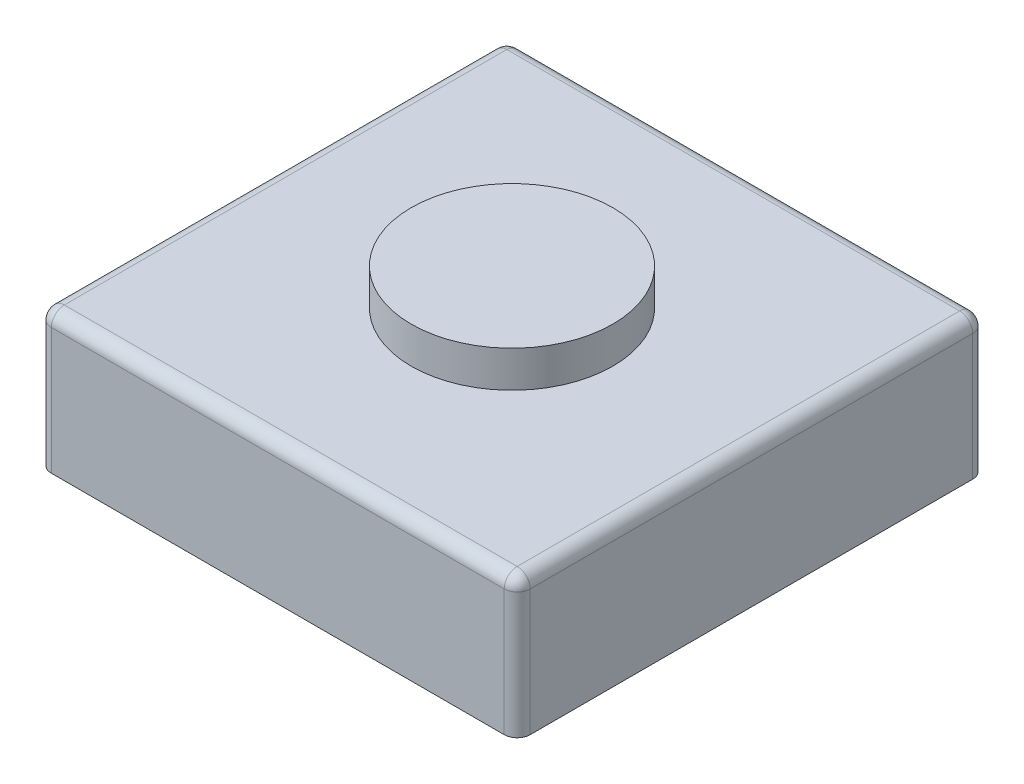
ISO-10303-21;
HEADER;
FILE_DESCRIPTION(('STEP AP214'),'2;1');
FILE_NAME('part.step','',(''),(''),'','','');
FILE_SCHEMA(('AUTOMOTIVE_DESIGN { 1 0 10303 214 1 1 1 1 }'));
ENDSEC;
DATA;
#1=APPLICATION_CONTEXT('core data for automotive mechanical design processes');
#2=APPLICATION_PROTOCOL_DEFINITION('international standard','automotive_design',2000,#1);
#3=PRODUCT_CONTEXT('',#1,'mechanical');
#4=PRODUCT('Part','Part','',(#3));
#5=PRODUCT_RELATED_PRODUCT_CATEGORY('part','',(#4));
#6=PRODUCT_DEFINITION_FORMATION('','',#4);
#7=PRODUCT_DEFINITION_CONTEXT('part definition',#1,'design');
#8=PRODUCT_DEFINITION('design','',#6,#7);
#9=PRODUCT_DEFINITION_SHAPE('','',#8);
#10=(LENGTH_UNIT() NAMED_UNIT(*) SI_UNIT(.MILLI.,.METRE.));
#11=(NAMED_UNIT(*) PLANE_ANGLE_UNIT() SI_UNIT($,.RADIAN.));
#12=(NAMED_UNIT(*) SI_UNIT($,.STERADIAN.) SOLID_ANGLE_UNIT());
#13=UNCERTAINTY_MEASURE_WITH_UNIT(LENGTH_MEASURE(1.E-05),#10,'distance_accuracy_value','');
#14=(GEOMETRIC_REPRESENTATION_CONTEXT(3) GLOBAL_UNCERTAINTY_ASSIGNED_CONTEXT((#13)) GLOBAL_UNIT_ASSIGNED_CONTEXT((#10,
#11,#12)) REPRESENTATION_CONTEXT('',''));
#15=CARTESIAN_POINT('',(0.,0.,0.));
#16=DIRECTION('',(0.,0.,1.));
#17=DIRECTION('',(1.,0.,0.));
#18=AXIS2_PLACEMENT_3D('',#15,#16,#17);
#19=CARTESIAN_POINT('',(-15.9344262295082,10.7,-10.327868852459));
#20=DIRECTION('',(1.,0.,0.));
#21=DIRECTION('',(0.,0.,-1.));
#22=AXIS2_PLACEMENT_3D('',#19,#20,#21);
#23=PLANE('',#22);
#24=DIRECTION('',(0.,0.,1.));
#25=VECTOR('',#24,1.);
#26=CARTESIAN_POINT('',(-15.9344262295082,0.,-10.327868852459));
#27=LINE('',#26,#25);
#28=CARTESIAN_POINT('',(-15.9344262295082,0.,-9.32786885245899));
#29=VERTEX_POINT('',#28);
#30=CARTESIAN_POINT('',(-15.9344262295082,0.,24.672131147541));
#31=VERTEX_POINT('',#30);
#32=EDGE_CURVE('E209',#29,#31,#27,.T.);
#33=ORIENTED_EDGE('',*,*,#32,.T.);
#34=DIRECTION('',(0.,-1.,0.));
#35=VECTOR('',#34,1.);
#36=CARTESIAN_POINT('',(-15.9344262295082,10.7,24.672131147541));
#37=LINE('',#36,#35);
#38=CARTESIAN_POINT('',(-15.9344262295082,9.7,24.672131147541));
#39=VERTEX_POINT('',#38);
#40=EDGE_CURVE('E60',#31,#39,#37,.F.);
#41=ORIENTED_EDGE('',*,*,#40,.T.);
#42=DIRECTION('',(0.,0.,1.));
#43=VECTOR('',#42,1.);
#44=CARTESIAN_POINT('',(-15.9344262295082,9.7,-10.327868852459));
#45=LINE('',#44,#43);
#46=CARTESIAN_POINT('',(-15.9344262295082,9.7,-9.32786885245899));
#47=VERTEX_POINT('',#46);
#48=EDGE_CURVE('E65',#39,#47,#45,.F.);
#49=ORIENTED_EDGE('',*,*,#48,.T.);
#50=DIRECTION('',(0.,-1.,0.));
#51=VECTOR('',#50,1.);
#52=CARTESIAN_POINT('',(-15.9344262295082,10.7,-9.32786885245899));
#53=LINE('',#52,#51);
#54=EDGE_CURVE('E178',#47,#29,#53,.T.);
#55=ORIENTED_EDGE('',*,*,#54,.T.);
#56=EDGE_LOOP('',(#33,#41,#49,#55));
#57=FACE_BOUND('',#56,.T.);
#58=ADVANCED_FACE('F43',(#57),#23,.F.);
#59=CARTESIAN_POINT('',(-15.9344262295082,10.7,25.672131147541));
#60=DIRECTION('',(0.,0.,-1.));
#61=DIRECTION('',(-1.,0.,0.));
#62=AXIS2_PLACEMENT_3D('',#59,#60,#61);
#63=PLANE('',#62);
#64=DIRECTION('',(1.,0.,0.));
#65=VECTOR('',#64,1.);
#66=CARTESIAN_POINT('',(-15.9344262295082,9.7,25.672131147541));
#67=LINE('',#66,#65);
#68=CARTESIAN_POINT('',(19.8655737704918,9.7,25.672131147541));
#69=VERTEX_POINT('',#68);
#70=CARTESIAN_POINT('',(-14.9344262295082,9.7,25.672131147541));
#71=VERTEX_POINT('',#70);
#72=EDGE_CURVE('E174',#69,#71,#67,.F.);
#73=ORIENTED_EDGE('',*,*,#72,.T.);
#74=DIRECTION('',(0.,-1.,0.));
#75=VECTOR('',#74,1.);
#76=CARTESIAN_POINT('',(-14.9344262295082,10.7,25.672131147541));
#77=LINE('',#76,#75);
#78=CARTESIAN_POINT('',(-14.9344262295082,0.,25.672131147541));
#79=VERTEX_POINT('',#78);
#80=EDGE_CURVE('E176',#71,#79,#77,.T.);
#81=ORIENTED_EDGE('',*,*,#80,.T.);
#82=DIRECTION('',(1.,0.,0.));
#83=VECTOR('',#82,1.);
#84=CARTESIAN_POINT('',(-15.9344262295082,0.,25.672131147541));
#85=LINE('',#84,#83);
#86=CARTESIAN_POINT('',(19.8655737704918,0.,25.672131147541));
#87=VERTEX_POINT('',#86);
#88=EDGE_CURVE('E211',#79,#87,#85,.T.);
#89=ORIENTED_EDGE('',*,*,#88,.T.);
#90=DIRECTION('',(0.,-1.,0.));
#91=VECTOR('',#90,1.);
#92=CARTESIAN_POINT('',(19.8655737704918,10.7,25.672131147541));
#93=LINE('',#92,#91);
#94=EDGE_CURVE('E172',#87,#69,#93,.F.);
#95=ORIENTED_EDGE('',*,*,#94,.T.);
#96=EDGE_LOOP('',(#73,#81,#89,#95));
#97=FACE_BOUND('',#96,.T.);
#98=ADVANCED_FACE('F266',(#97),#63,.F.);
#99=CARTESIAN_POINT('',(20.8655737704918,10.7,-10.327868852459));
#100=DIRECTION('',(-1.,0.,0.));
#101=DIRECTION('',(0.,0.,1.));
#102=AXIS2_PLACEMENT_3D('',#99,#100,#101);
#103=PLANE('',#102);
#104=DIRECTION('',(0.,0.,-1.));
#105=VECTOR('',#104,1.);
#106=CARTESIAN_POINT('',(20.8655737704918,0.,-10.327868852459));
#107=LINE('',#106,#105);
#108=CARTESIAN_POINT('',(20.8655737704918,0.,24.672131147541));
#109=VERTEX_POINT('',#108);
#110=CARTESIAN_POINT('',(20.8655737704918,0.,-9.32786885245899));
#111=VERTEX_POINT('',#110);
#112=EDGE_CURVE('E215',#109,#111,#107,.T.);
#113=ORIENTED_EDGE('',*,*,#112,.T.);
#114=DIRECTION('',(0.,-1.,0.));
#115=VECTOR('',#114,1.);
#116=CARTESIAN_POINT('',(20.8655737704918,10.7,-9.32786885245899));
#117=LINE('',#116,#115);
#118=CARTESIAN_POINT('',(20.8655737704918,9.7,-9.32786885245899));
#119=VERTEX_POINT('',#118);
#120=EDGE_CURVE('E170',#111,#119,#117,.F.);
#121=ORIENTED_EDGE('',*,*,#120,.T.);
#122=DIRECTION('',(0.,0.,-1.));
#123=VECTOR('',#122,1.);
#124=CARTESIAN_POINT('',(20.8655737704918,9.7,25.672131147541));
#125=LINE('',#124,#123);
#126=CARTESIAN_POINT('',(20.8655737704918,9.7,24.672131147541));
#127=VERTEX_POINT('',#126);
#128=EDGE_CURVE('E168',#119,#127,#125,.F.);
#129=ORIENTED_EDGE('',*,*,#128,.T.);
#130=DIRECTION('',(0.,-1.,0.));
#131=VECTOR('',#130,1.);
#132=CARTESIAN_POINT('',(20.8655737704918,10.7,24.672131147541));
#133=LINE('',#132,#131);
#134=EDGE_CURVE('E166',#127,#109,#133,.T.);
#135=ORIENTED_EDGE('',*,*,#134,.T.);
#136=EDGE_LOOP('',(#113,#121,#129,#135));
#137=FACE_BOUND('',#136,.T.);
#138=ADVANCED_FACE('F271',(#137),#103,.F.);
#139=CARTESIAN_POINT('',(-15.9344262295082,10.7,-10.327868852459));
#140=DIRECTION('',(0.,0.,1.));
#141=DIRECTION('',(1.,0.,0.));
#142=AXIS2_PLACEMENT_3D('',#139,#140,#141);
#143=PLANE('',#142);
#144=DIRECTION('',(-1.,0.,0.));
#145=VECTOR('',#144,1.);
#146=CARTESIAN_POINT('',(-15.9344262295082,0.,-10.327868852459));
#147=LINE('',#146,#145);
#148=CARTESIAN_POINT('',(19.8655737704918,0.,-10.327868852459));
#149=VERTEX_POINT('',#148);
#150=CARTESIAN_POINT('',(-14.9344262295082,0.,-10.327868852459));
#151=VERTEX_POINT('',#150);
#152=EDGE_CURVE('E151',#149,#151,#147,.T.);
#153=ORIENTED_EDGE('',*,*,#152,.T.);
#154=DIRECTION('',(0.,-1.,0.));
#155=VECTOR('',#154,1.);
#156=CARTESIAN_POINT('',(-14.9344262295082,10.7,-10.327868852459));
#157=LINE('',#156,#155);
#158=CARTESIAN_POINT('',(-14.9344262295082,9.7,-10.327868852459));
#159=VERTEX_POINT('',#158);
#160=EDGE_CURVE('E164',#151,#159,#157,.F.);
#161=ORIENTED_EDGE('',*,*,#160,.T.);
#162=DIRECTION('',(-1.,0.,0.));
#163=VECTOR('',#162,1.);
#164=CARTESIAN_POINT('',(20.8655737704918,9.7,-10.327868852459));
#165=LINE('',#164,#163);
#166=CARTESIAN_POINT('',(19.8655737704918,9.7,-10.327868852459));
#167=VERTEX_POINT('',#166);
#168=EDGE_CURVE('E128',#159,#167,#165,.F.);
#169=ORIENTED_EDGE('',*,*,#168,.T.);
#170=DIRECTION('',(0.,-1.,0.));
#171=VECTOR('',#170,1.);
#172=CARTESIAN_POINT('',(19.8655737704918,10.7,-10.327868852459));
#173=LINE('',#172,#171);
#174=EDGE_CURVE('E157',#167,#149,#173,.T.);
#175=ORIENTED_EDGE('',*,*,#174,.T.);
#176=EDGE_LOOP('',(#153,#161,#169,#175));
#177=FACE_BOUND('',#176,.T.);
#178=ADVANCED_FACE('F243',(#177),#143,.F.);
#179=CARTESIAN_POINT('',(0.,10.7,0.));
#180=DIRECTION('',(0.,1.,0.));
#181=DIRECTION('',(0.,0.,1.));
#182=AXIS2_PLACEMENT_3D('',#179,#180,#181);
#183=PLANE('',#182);
#184=CARTESIAN_POINT('',(2.4655737704918,10.7,7.67213114754101));
#185=DIRECTION('',(0.,1.,0.));
#186=DIRECTION('',(0.,0.,1.));
#187=AXIS2_PLACEMENT_3D('',#184,#185,#186);
#188=CIRCLE('',#187,7.75);
#189=CARTESIAN_POINT('',(2.4655737704918,10.7,15.422131147541));
#190=VERTEX_POINT('',#189);
#191=EDGE_CURVE('E218',#190,#190,#188,.T.);
#192=ORIENTED_EDGE('',*,*,#191,.F.);
#193=EDGE_LOOP('',(#192));
#194=FACE_BOUND('',#193,.T.);
#195=DIRECTION('',(0.,0.,-1.));
#196=VECTOR('',#195,1.);
#197=CARTESIAN_POINT('',(19.8655737704918,10.7,-10.327868852459));
#198=LINE('',#197,#196);
#199=CARTESIAN_POINT('',(19.8655737704918,10.7,24.672131147541));
#200=VERTEX_POINT('',#199);
#201=CARTESIAN_POINT('',(19.8655737704918,10.7,-9.32786885245899));
#202=VERTEX_POINT('',#201);
#203=EDGE_CURVE('E155',#200,#202,#198,.T.);
#204=ORIENTED_EDGE('',*,*,#203,.T.);
#205=DIRECTION('',(-1.,0.,0.));
#206=VECTOR('',#205,1.);
#207=CARTESIAN_POINT('',(-15.9344262295082,10.7,-9.32786885245899));
#208=LINE('',#207,#206);
#209=CARTESIAN_POINT('',(-14.9344262295082,10.7,-9.32786885245899));
#210=VERTEX_POINT('',#209);
#211=EDGE_CURVE('E126',#202,#210,#208,.T.);
#212=ORIENTED_EDGE('',*,*,#211,.T.);
#213=DIRECTION('',(0.,0.,1.));
#214=VECTOR('',#213,1.);
#215=CARTESIAN_POINT('',(-14.9344262295082,10.7,25.672131147541));
#216=LINE('',#215,#214);
#217=CARTESIAN_POINT('',(-14.9344262295082,10.7,24.672131147541));
#218=VERTEX_POINT('',#217);
#219=EDGE_CURVE('E144',#210,#218,#216,.T.);
#220=ORIENTED_EDGE('',*,*,#219,.T.);
#221=DIRECTION('',(1.,0.,0.));
#222=VECTOR('',#221,1.);
#223=CARTESIAN_POINT('',(20.8655737704918,10.7,24.672131147541));
#224=LINE('',#223,#222);
#225=EDGE_CURVE('E150',#218,#200,#224,.T.);
#226=ORIENTED_EDGE('',*,*,#225,.T.);
#227=EDGE_LOOP('',(#204,#212,#220,#226));
#228=FACE_BOUND('',#227,.T.);
#229=ADVANCED_FACE('F153',(#194,#228),#183,.T.);
#230=CARTESIAN_POINT('',(0.,0.,0.));
#231=DIRECTION('',(0.,1.,0.));
#232=DIRECTION('',(0.,0.,1.));
#233=AXIS2_PLACEMENT_3D('',#230,#231,#232);
#234=PLANE('',#233);
#235=ORIENTED_EDGE('',*,*,#88,.F.);
#236=CARTESIAN_POINT('',(-14.9344262295082,0.,24.672131147541));
#237=DIRECTION('',(0.,1.,0.));
#238=DIRECTION('',(0.,0.,1.));
#239=AXIS2_PLACEMENT_3D('',#236,#237,#238);
#240=CIRCLE('',#239,1.);
#241=EDGE_CURVE('E11',#79,#31,#240,.F.);
#242=ORIENTED_EDGE('',*,*,#241,.T.);
#243=ORIENTED_EDGE('',*,*,#32,.F.);
#244=CARTESIAN_POINT('',(-14.9344262295082,0.,-9.32786885245899));
#245=DIRECTION('',(0.,1.,0.));
#246=DIRECTION('',(0.,0.,1.));
#247=AXIS2_PLACEMENT_3D('',#244,#245,#246);
#248=CIRCLE('',#247,1.);
#249=EDGE_CURVE('E52',#29,#151,#248,.F.);
#250=ORIENTED_EDGE('',*,*,#249,.T.);
#251=ORIENTED_EDGE('',*,*,#152,.F.);
#252=CARTESIAN_POINT('',(19.8655737704918,0.,-9.32786885245899));
#253=DIRECTION('',(0.,1.,0.));
#254=DIRECTION('',(0.,0.,1.));
#255=AXIS2_PLACEMENT_3D('',#252,#253,#254);
#256=CIRCLE('',#255,1.);
#257=EDGE_CURVE('E184',#149,#111,#256,.F.);
#258=ORIENTED_EDGE('',*,*,#257,.T.);
#259=ORIENTED_EDGE('',*,*,#112,.F.);
#260=CARTESIAN_POINT('',(19.8655737704918,0.,24.672131147541));
#261=DIRECTION('',(0.,1.,0.));
#262=DIRECTION('',(0.,0.,1.));
#263=AXIS2_PLACEMENT_3D('',#260,#261,#262);
#264=CIRCLE('',#263,1.);
#265=EDGE_CURVE('E182',#109,#87,#264,.F.);
#266=ORIENTED_EDGE('',*,*,#265,.T.);
#267=EDGE_LOOP('',(#235,#242,#243,#250,#251,#258,#259,#266));
#268=FACE_BOUND('',#267,.T.);
#269=ADVANCED_FACE('F250',(#268),#234,.F.);
#270=CARTESIAN_POINT('',(19.8655737704918,10.7,24.672131147541));
#271=DIRECTION('',(0.,-1.,0.));
#272=DIRECTION('',(0.,0.,-1.));
#273=AXIS2_PLACEMENT_3D('',#270,#271,#272);
#274=CYLINDRICAL_SURFACE('',#273,1.);
#275=ORIENTED_EDGE('',*,*,#265,.F.);
#276=ORIENTED_EDGE('',*,*,#134,.F.);
#277=CARTESIAN_POINT('',(19.8655737704918,9.7,24.672131147541));
#278=DIRECTION('',(0.,1.,0.));
#279=DIRECTION('',(0.,0.,1.));
#280=AXIS2_PLACEMENT_3D('',#277,#278,#279);
#281=CIRCLE('',#280,1.);
#282=EDGE_CURVE('E47',#69,#127,#281,.T.);
#283=ORIENTED_EDGE('',*,*,#282,.F.);
#284=ORIENTED_EDGE('',*,*,#94,.F.);
#285=EDGE_LOOP('',(#275,#276,#283,#284));
#286=FACE_BOUND('',#285,.T.);
#287=ADVANCED_FACE('F45',(#286),#274,.T.);
#288=CARTESIAN_POINT('',(0.,9.7,24.672131147541));
#289=DIRECTION('',(-1.,0.,0.));
#290=DIRECTION('',(0.,0.,1.));
#291=AXIS2_PLACEMENT_3D('',#288,#289,#290);
#292=CYLINDRICAL_SURFACE('',#291,1.);
#293=CARTESIAN_POINT('',(-14.9344262295082,9.7,24.672131147541));
#294=DIRECTION('',(-1.,0.,0.));
#295=DIRECTION('',(0.,0.,1.));
#296=AXIS2_PLACEMENT_3D('',#293,#294,#295);
#297=CIRCLE('',#296,1.);
#298=EDGE_CURVE('E201',#71,#218,#297,.T.);
#299=ORIENTED_EDGE('',*,*,#298,.F.);
#300=ORIENTED_EDGE('',*,*,#72,.F.);
#301=CARTESIAN_POINT('',(19.8655737704918,9.7,24.672131147541));
#302=DIRECTION('',(1.,0.,0.));
#303=DIRECTION('',(0.,0.,-1.));
#304=AXIS2_PLACEMENT_3D('',#301,#302,#303);
#305=CIRCLE('',#304,1.);
#306=EDGE_CURVE('E203',#200,#69,#305,.T.);
#307=ORIENTED_EDGE('',*,*,#306,.F.);
#308=ORIENTED_EDGE('',*,*,#225,.F.);
#309=EDGE_LOOP('',(#299,#300,#307,#308));
#310=FACE_BOUND('',#309,.T.);
#311=ADVANCED_FACE('F227',(#310),#292,.T.);
#312=CARTESIAN_POINT('',(-14.9344262295082,10.7,24.672131147541));
#313=DIRECTION('',(0.,-1.,0.));
#314=DIRECTION('',(0.,0.,-1.));
#315=AXIS2_PLACEMENT_3D('',#312,#313,#314);
#316=CYLINDRICAL_SURFACE('',#315,1.);
#317=ORIENTED_EDGE('',*,*,#241,.F.);
#318=ORIENTED_EDGE('',*,*,#80,.F.);
#319=CARTESIAN_POINT('',(-14.9344262295082,9.7,24.672131147541));
#320=DIRECTION('',(0.,1.,0.));
#321=DIRECTION('',(0.,0.,1.));
#322=AXIS2_PLACEMENT_3D('',#319,#320,#321);
#323=CIRCLE('',#322,1.);
#324=EDGE_CURVE('E198',#39,#71,#323,.T.);
#325=ORIENTED_EDGE('',*,*,#324,.F.);
#326=ORIENTED_EDGE('',*,*,#40,.F.);
#327=EDGE_LOOP('',(#317,#318,#325,#326));
#328=FACE_BOUND('',#327,.T.);
#329=ADVANCED_FACE('F254',(#328),#316,.T.);
#330=CARTESIAN_POINT('',(19.8655737704918,9.7,24.672131147541));
#331=DIRECTION('',(0.,0.,1.));
#332=DIRECTION('',(1.,0.,0.));
#333=AXIS2_PLACEMENT_3D('',#330,#331,#332);
#334=SPHERICAL_SURFACE('',#333,1.);
#335=ORIENTED_EDGE('',*,*,#306,.T.);
#336=ORIENTED_EDGE('',*,*,#282,.T.);
#337=CARTESIAN_POINT('',(19.8655737704918,9.7,24.672131147541));
#338=DIRECTION('',(0.,0.,1.));
#339=DIRECTION('',(1.,0.,0.));
#340=AXIS2_PLACEMENT_3D('',#337,#338,#339);
#341=CIRCLE('',#340,1.);
#342=EDGE_CURVE('E195',#200,#127,#341,.F.);
#343=ORIENTED_EDGE('',*,*,#342,.F.);
#344=EDGE_LOOP('',(#335,#336,#343));
#345=FACE_BOUND('',#344,.T.);
#346=ADVANCED_FACE('F228',(#345),#334,.T.);
#347=CARTESIAN_POINT('',(-14.9344262295082,9.7,24.672131147541));
#348=DIRECTION('',(0.,0.,1.));
#349=DIRECTION('',(1.,0.,0.));
#350=AXIS2_PLACEMENT_3D('',#347,#348,#349);
#351=SPHERICAL_SURFACE('',#350,1.);
#352=ORIENTED_EDGE('',*,*,#324,.T.);
#353=ORIENTED_EDGE('',*,*,#298,.T.);
#354=CARTESIAN_POINT('',(-14.9344262295082,9.7,24.672131147541));
#355=DIRECTION('',(0.,0.,1.));
#356=DIRECTION('',(1.,0.,0.));
#357=AXIS2_PLACEMENT_3D('',#354,#355,#356);
#358=CIRCLE('',#357,1.);
#359=EDGE_CURVE('E147',#39,#218,#358,.F.);
#360=ORIENTED_EDGE('',*,*,#359,.F.);
#361=EDGE_LOOP('',(#352,#353,#360));
#362=FACE_BOUND('',#361,.T.);
#363=ADVANCED_FACE('F256',(#362),#351,.T.);
#364=CARTESIAN_POINT('',(19.8655737704918,10.7,-9.32786885245899));
#365=DIRECTION('',(0.,-1.,0.));
#366=DIRECTION('',(0.,0.,-1.));
#367=AXIS2_PLACEMENT_3D('',#364,#365,#366);
#368=CYLINDRICAL_SURFACE('',#367,1.);
#369=ORIENTED_EDGE('',*,*,#257,.F.);
#370=ORIENTED_EDGE('',*,*,#174,.F.);
#371=CARTESIAN_POINT('',(19.8655737704918,9.7,-9.32786885245899));
#372=DIRECTION('',(0.,1.,0.));
#373=DIRECTION('',(0.,0.,1.));
#374=AXIS2_PLACEMENT_3D('',#371,#372,#373);
#375=CIRCLE('',#374,1.);
#376=EDGE_CURVE('E191',#119,#167,#375,.T.);
#377=ORIENTED_EDGE('',*,*,#376,.F.);
#378=ORIENTED_EDGE('',*,*,#120,.F.);
#379=EDGE_LOOP('',(#369,#370,#377,#378));
#380=FACE_BOUND('',#379,.T.);
#381=ADVANCED_FACE('F240',(#380),#368,.T.);
#382=CARTESIAN_POINT('',(19.8655737704918,9.7,0.));
#383=DIRECTION('',(0.,0.,1.));
#384=DIRECTION('',(1.,0.,0.));
#385=AXIS2_PLACEMENT_3D('',#382,#383,#384);
#386=CYLINDRICAL_SURFACE('',#385,1.);
#387=ORIENTED_EDGE('',*,*,#342,.T.);
#388=ORIENTED_EDGE('',*,*,#128,.F.);
#389=CARTESIAN_POINT('',(19.8655737704918,9.7,-9.32786885245899));
#390=DIRECTION('',(0.,0.,-1.));
#391=DIRECTION('',(-1.,0.,0.));
#392=AXIS2_PLACEMENT_3D('',#389,#390,#391);
#393=CIRCLE('',#392,1.);
#394=EDGE_CURVE('E141',#202,#119,#393,.T.);
#395=ORIENTED_EDGE('',*,*,#394,.F.);
#396=ORIENTED_EDGE('',*,*,#203,.F.);
#397=EDGE_LOOP('',(#387,#388,#395,#396));
#398=FACE_BOUND('',#397,.T.);
#399=ADVANCED_FACE('F231',(#398),#386,.T.);
#400=CARTESIAN_POINT('',(-14.9344262295082,9.7,0.));
#401=DIRECTION('',(0.,0.,-1.));
#402=DIRECTION('',(-1.,0.,0.));
#403=AXIS2_PLACEMENT_3D('',#400,#401,#402);
#404=CYLINDRICAL_SURFACE('',#403,1.);
#405=ORIENTED_EDGE('',*,*,#359,.T.);
#406=ORIENTED_EDGE('',*,*,#219,.F.);
#407=CARTESIAN_POINT('',(-14.9344262295082,9.7,-9.32786885245899));
#408=DIRECTION('',(0.,0.,-1.));
#409=DIRECTION('',(-1.,0.,0.));
#410=AXIS2_PLACEMENT_3D('',#407,#408,#409);
#411=CIRCLE('',#410,1.);
#412=EDGE_CURVE('E135',#47,#210,#411,.T.);
#413=ORIENTED_EDGE('',*,*,#412,.F.);
#414=ORIENTED_EDGE('',*,*,#48,.F.);
#415=EDGE_LOOP('',(#405,#406,#413,#414));
#416=FACE_BOUND('',#415,.T.);
#417=ADVANCED_FACE('F145',(#416),#404,.T.);
#418=CARTESIAN_POINT('',(-14.9344262295082,10.7,-9.32786885245899));
#419=DIRECTION('',(0.,-1.,0.));
#420=DIRECTION('',(0.,0.,-1.));
#421=AXIS2_PLACEMENT_3D('',#418,#419,#420);
#422=CYLINDRICAL_SURFACE('',#421,1.);
#423=ORIENTED_EDGE('',*,*,#249,.F.);
#424=ORIENTED_EDGE('',*,*,#54,.F.);
#425=CARTESIAN_POINT('',(-14.9344262295082,9.7,-9.32786885245899));
#426=DIRECTION('',(0.,1.,0.));
#427=DIRECTION('',(0.,0.,1.));
#428=AXIS2_PLACEMENT_3D('',#425,#426,#427);
#429=CIRCLE('',#428,1.);
#430=EDGE_CURVE('E139',#159,#47,#429,.T.);
#431=ORIENTED_EDGE('',*,*,#430,.F.);
#432=ORIENTED_EDGE('',*,*,#160,.F.);
#433=EDGE_LOOP('',(#423,#424,#431,#432));
#434=FACE_BOUND('',#433,.T.);
#435=ADVANCED_FACE('F247',(#434),#422,.T.);
#436=CARTESIAN_POINT('',(19.8655737704918,9.7,-9.32786885245899));
#437=DIRECTION('',(1.,0.,0.));
#438=DIRECTION('',(0.,0.,-1.));
#439=AXIS2_PLACEMENT_3D('',#436,#437,#438);
#440=SPHERICAL_SURFACE('',#439,1.);
#441=ORIENTED_EDGE('',*,*,#394,.T.);
#442=ORIENTED_EDGE('',*,*,#376,.T.);
#443=CARTESIAN_POINT('',(19.8655737704918,9.7,-9.32786885245899));
#444=DIRECTION('',(1.,0.,0.));
#445=DIRECTION('',(0.,0.,-1.));
#446=AXIS2_PLACEMENT_3D('',#443,#444,#445);
#447=CIRCLE('',#446,1.);
#448=EDGE_CURVE('E131',#202,#167,#447,.F.);
#449=ORIENTED_EDGE('',*,*,#448,.F.);
#450=EDGE_LOOP('',(#441,#442,#449));
#451=FACE_BOUND('',#450,.T.);
#452=ADVANCED_FACE('F235',(#451),#440,.T.);
#453=CARTESIAN_POINT('',(-14.9344262295082,9.7,-9.32786885245899));
#454=DIRECTION('',(-1.,0.,0.));
#455=DIRECTION('',(0.,0.,1.));
#456=AXIS2_PLACEMENT_3D('',#453,#454,#455);
#457=SPHERICAL_SURFACE('',#456,1.);
#458=ORIENTED_EDGE('',*,*,#430,.T.);
#459=ORIENTED_EDGE('',*,*,#412,.T.);
#460=CARTESIAN_POINT('',(-14.9344262295082,9.7,-9.32786885245899));
#461=DIRECTION('',(-1.,0.,0.));
#462=DIRECTION('',(0.,0.,1.));
#463=AXIS2_PLACEMENT_3D('',#460,#461,#462);
#464=CIRCLE('',#463,1.);
#465=EDGE_CURVE('E122',#159,#210,#464,.F.);
#466=ORIENTED_EDGE('',*,*,#465,.F.);
#467=EDGE_LOOP('',(#458,#459,#466));
#468=FACE_BOUND('',#467,.T.);
#469=ADVANCED_FACE('F137',(#468),#457,.T.);
#470=CARTESIAN_POINT('',(0.,9.7,-9.32786885245899));
#471=DIRECTION('',(1.,0.,0.));
#472=DIRECTION('',(0.,0.,-1.));
#473=AXIS2_PLACEMENT_3D('',#470,#471,#472);
#474=CYLINDRICAL_SURFACE('',#473,1.);
#475=ORIENTED_EDGE('',*,*,#448,.T.);
#476=ORIENTED_EDGE('',*,*,#168,.F.);
#477=ORIENTED_EDGE('',*,*,#465,.T.);
#478=ORIENTED_EDGE('',*,*,#211,.F.);
#479=EDGE_LOOP('',(#475,#476,#477,#478));
#480=FACE_BOUND('',#479,.T.);
#481=ADVANCED_FACE('F124',(#480),#474,.T.);
#482=CARTESIAN_POINT('',(2.4655737704918,13.5,7.67213114754101));
#483=DIRECTION('',(0.,-1.,0.));
#484=DIRECTION('',(0.,0.,-1.));
#485=AXIS2_PLACEMENT_3D('',#482,#483,#484);
#486=CYLINDRICAL_SURFACE('',#485,7.75);
#487=CARTESIAN_POINT('',(2.4655737704918,13.5,7.67213114754101));
#488=DIRECTION('',(0.,1.,0.));
#489=DIRECTION('',(0.,0.,1.));
#490=AXIS2_PLACEMENT_3D('',#487,#488,#489);
#491=CIRCLE('',#490,7.75);
#492=CARTESIAN_POINT('',(2.4655737704918,13.5,15.422131147541));
#493=VERTEX_POINT('',#492);
#494=EDGE_CURVE('E132',#493,#493,#491,.T.);
#495=ORIENTED_EDGE('',*,*,#494,.F.);
#496=EDGE_LOOP('',(#495));
#497=FACE_BOUND('',#496,.T.);
#498=ORIENTED_EDGE('',*,*,#191,.T.);
#499=EDGE_LOOP('',(#498));
#500=FACE_BOUND('',#499,.T.);
#501=ADVANCED_FACE('F278',(#497,#500),#486,.T.);
#502=CARTESIAN_POINT('',(2.4655737704918,13.5,7.67213114754101));
#503=DIRECTION('',(0.,1.,0.));
#504=DIRECTION('',(0.,0.,1.));
#505=AXIS2_PLACEMENT_3D('',#502,#503,#504);
#506=PLANE('',#505);
#507=ORIENTED_EDGE('',*,*,#494,.T.);
#508=EDGE_LOOP('',(#507));
#509=FACE_BOUND('',#508,.T.);
#510=ADVANCED_FACE('F334',(#509),#506,.T.);
#511=CLOSED_SHELL('',(#58,#98,#138,#178,#229,#269,#287,#311,#329,#346,#363,#381,#399,#417,#435,
#452,#469,#481,#501,#510));
#512=MANIFOLD_SOLID_BREP('B2',#511);
#513=ADVANCED_BREP_SHAPE_REPRESENTATION('',(#18,#512),#14);
#514=SHAPE_DEFINITION_REPRESENTATION(#9,#513);
ENDSEC;
END-ISO-10303-21;
